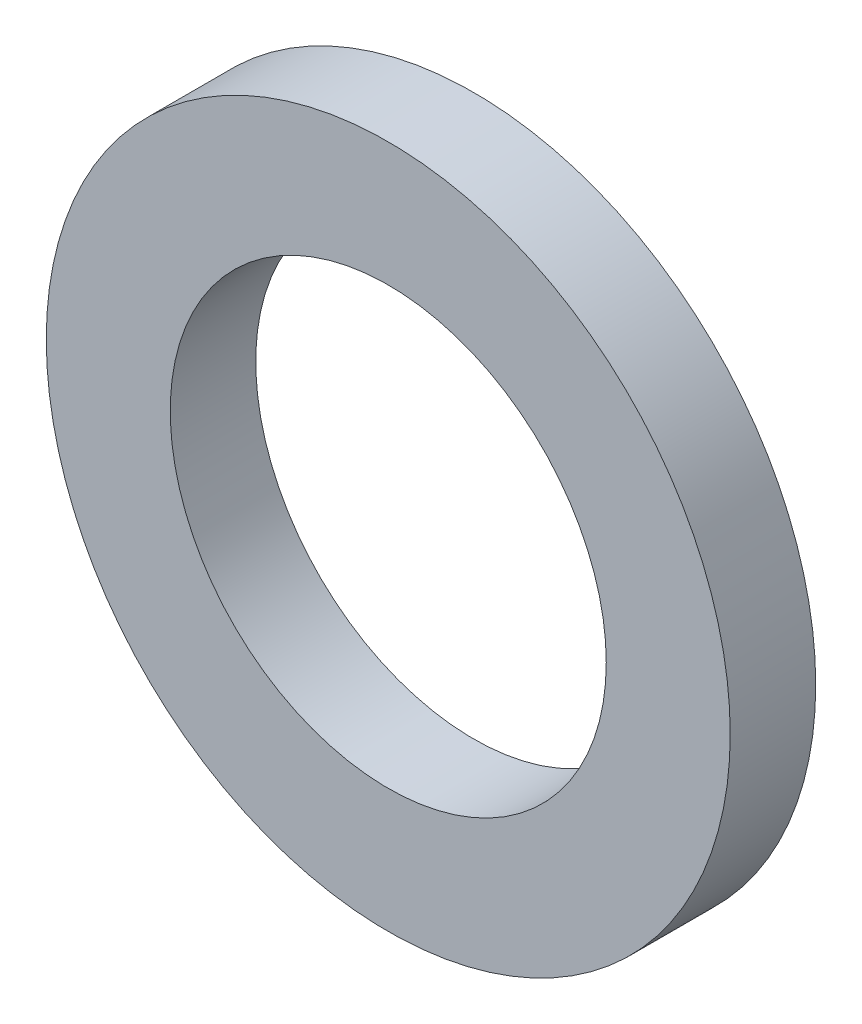
ISO-10303-21;
HEADER;
FILE_DESCRIPTION(('STEP AP214'),'2;1');
FILE_NAME('part.step','',(''),(''),'','','');
FILE_SCHEMA(('AUTOMOTIVE_DESIGN { 1 0 10303 214 1 1 1 1 }'));
ENDSEC;
DATA;
#1=APPLICATION_CONTEXT('core data for automotive mechanical design processes');
#2=APPLICATION_PROTOCOL_DEFINITION('international standard','automotive_design',2000,#1);
#3=PRODUCT_CONTEXT('',#1,'mechanical');
#4=PRODUCT('Part','Part','',(#3));
#5=PRODUCT_RELATED_PRODUCT_CATEGORY('part','',(#4));
#6=PRODUCT_DEFINITION_FORMATION('','',#4);
#7=PRODUCT_DEFINITION_CONTEXT('part definition',#1,'design');
#8=PRODUCT_DEFINITION('design','',#6,#7);
#9=PRODUCT_DEFINITION_SHAPE('','',#8);
#10=(LENGTH_UNIT() NAMED_UNIT(*) SI_UNIT(.MILLI.,.METRE.));
#11=(NAMED_UNIT(*) PLANE_ANGLE_UNIT() SI_UNIT($,.RADIAN.));
#12=(NAMED_UNIT(*) SI_UNIT($,.STERADIAN.) SOLID_ANGLE_UNIT());
#13=UNCERTAINTY_MEASURE_WITH_UNIT(LENGTH_MEASURE(1.E-05),#10,'distance_accuracy_value','');
#14=(GEOMETRIC_REPRESENTATION_CONTEXT(3) GLOBAL_UNCERTAINTY_ASSIGNED_CONTEXT((#13)) GLOBAL_UNIT_ASSIGNED_CONTEXT((#10,
#11,#12)) REPRESENTATION_CONTEXT('',''));
#15=CARTESIAN_POINT('',(0.,0.,0.));
#16=DIRECTION('',(0.,0.,1.));
#17=DIRECTION('',(1.,0.,0.));
#18=AXIS2_PLACEMENT_3D('',#15,#16,#17);
#19=CARTESIAN_POINT('',(0.,0.,2.));
#20=DIRECTION('',(0.,0.,1.));
#21=DIRECTION('',(1.,0.,0.));
#22=AXIS2_PLACEMENT_3D('',#19,#20,#21);
#23=PLANE('',#22);
#24=CARTESIAN_POINT('',(0.,0.,2.));
#25=DIRECTION('',(0.,0.,1.));
#26=DIRECTION('',(1.,0.,0.));
#27=AXIS2_PLACEMENT_3D('',#24,#25,#26);
#28=CIRCLE('',#27,8.);
#29=CARTESIAN_POINT('',(8.,0.,2.));
#30=VERTEX_POINT('',#29);
#31=EDGE_CURVE('E10',#30,#30,#28,.T.);
#32=ORIENTED_EDGE('',*,*,#31,.T.);
#33=EDGE_LOOP('',(#32));
#34=FACE_BOUND('',#33,.T.);
#35=CARTESIAN_POINT('',(0.,0.,2.));
#36=DIRECTION('',(0.,0.,1.));
#37=DIRECTION('',(1.,0.,0.));
#38=AXIS2_PLACEMENT_3D('',#35,#36,#37);
#39=CIRCLE('',#38,5.1);
#40=CARTESIAN_POINT('',(5.1,0.,2.));
#41=VERTEX_POINT('',#40);
#42=EDGE_CURVE('E42',#41,#41,#39,.T.);
#43=ORIENTED_EDGE('',*,*,#42,.F.);
#44=EDGE_LOOP('',(#43));
#45=FACE_BOUND('',#44,.T.);
#46=ADVANCED_FACE('F31',(#34,#45),#23,.T.);
#47=CARTESIAN_POINT('',(0.,0.,0.));
#48=DIRECTION('',(0.,0.,1.));
#49=DIRECTION('',(1.,0.,0.));
#50=AXIS2_PLACEMENT_3D('',#47,#48,#49);
#51=PLANE('',#50);
#52=CARTESIAN_POINT('',(0.,0.,0.));
#53=DIRECTION('',(0.,0.,1.));
#54=DIRECTION('',(1.,0.,0.));
#55=AXIS2_PLACEMENT_3D('',#52,#53,#54);
#56=CIRCLE('',#55,8.);
#57=CARTESIAN_POINT('',(8.,0.,0.));
#58=VERTEX_POINT('',#57);
#59=EDGE_CURVE('E35',#58,#58,#56,.T.);
#60=ORIENTED_EDGE('',*,*,#59,.F.);
#61=EDGE_LOOP('',(#60));
#62=FACE_BOUND('',#61,.T.);
#63=CARTESIAN_POINT('',(0.,0.,0.));
#64=DIRECTION('',(0.,0.,1.));
#65=DIRECTION('',(1.,0.,0.));
#66=AXIS2_PLACEMENT_3D('',#63,#64,#65);
#67=CIRCLE('',#66,5.1);
#68=CARTESIAN_POINT('',(5.1,0.,0.));
#69=VERTEX_POINT('',#68);
#70=EDGE_CURVE('E44',#69,#69,#67,.T.);
#71=ORIENTED_EDGE('',*,*,#70,.T.);
#72=EDGE_LOOP('',(#71));
#73=FACE_BOUND('',#72,.T.);
#74=ADVANCED_FACE('F54',(#62,#73),#51,.F.);
#75=CARTESIAN_POINT('',(0.,0.,2.));
#76=DIRECTION('',(0.,0.,-1.));
#77=DIRECTION('',(-1.,0.,0.));
#78=AXIS2_PLACEMENT_3D('',#75,#76,#77);
#79=CYLINDRICAL_SURFACE('',#78,8.);
#80=ORIENTED_EDGE('',*,*,#31,.F.);
#81=EDGE_LOOP('',(#80));
#82=FACE_BOUND('',#81,.T.);
#83=ORIENTED_EDGE('',*,*,#59,.T.);
#84=EDGE_LOOP('',(#83));
#85=FACE_BOUND('',#84,.T.);
#86=ADVANCED_FACE('F33',(#82,#85),#79,.T.);
#87=CARTESIAN_POINT('',(0.,0.,2.));
#88=DIRECTION('',(0.,0.,-1.));
#89=DIRECTION('',(-1.,0.,0.));
#90=AXIS2_PLACEMENT_3D('',#87,#88,#89);
#91=CYLINDRICAL_SURFACE('',#90,5.1);
#92=ORIENTED_EDGE('',*,*,#42,.T.);
#93=EDGE_LOOP('',(#92));
#94=FACE_BOUND('',#93,.T.);
#95=ORIENTED_EDGE('',*,*,#70,.F.);
#96=EDGE_LOOP('',(#95));
#97=FACE_BOUND('',#96,.T.);
#98=ADVANCED_FACE('F50',(#94,#97),#91,.F.);
#99=CLOSED_SHELL('',(#46,#74,#86,#98));
#100=MANIFOLD_SOLID_BREP('B2',#99);
#101=ADVANCED_BREP_SHAPE_REPRESENTATION('',(#18,#100),#14);
#102=SHAPE_DEFINITION_REPRESENTATION(#9,#101);
ENDSEC;
END-ISO-10303-21;
